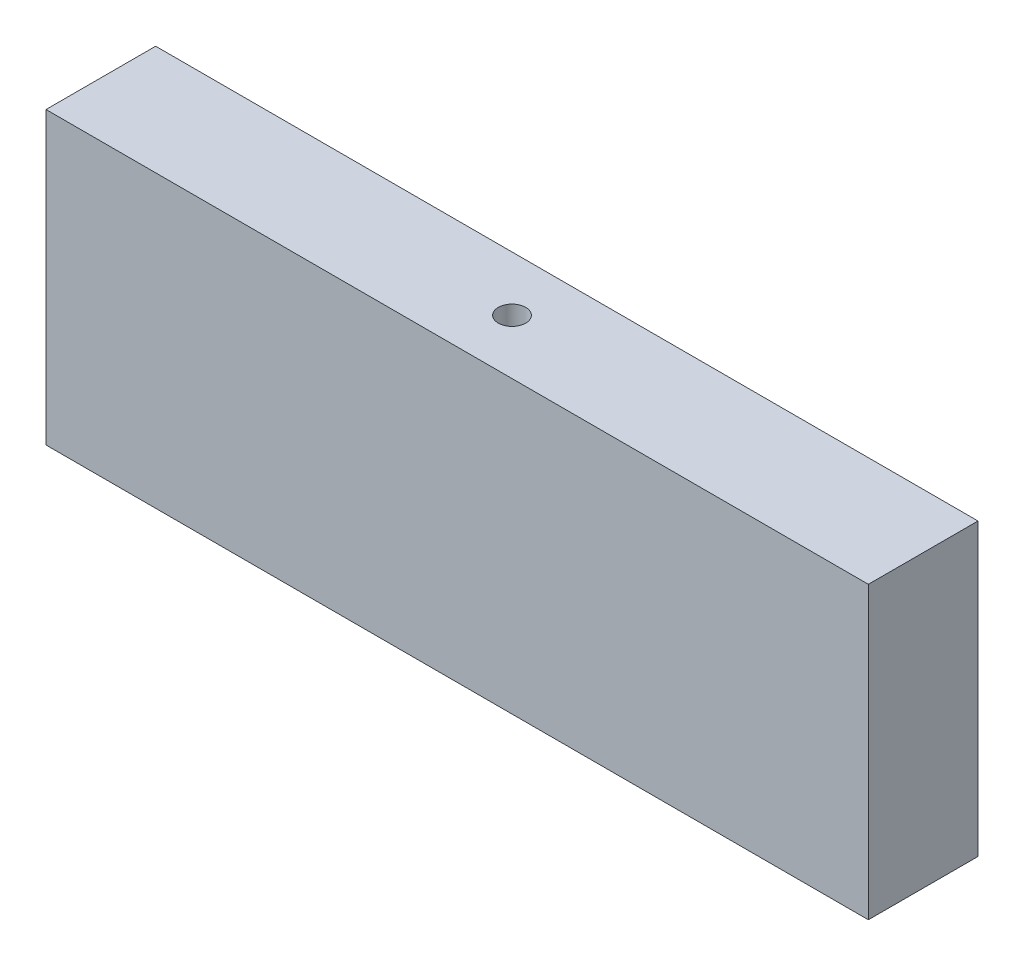
ISO-10303-21;
HEADER;
FILE_DESCRIPTION(('STEP AP214'),'2;1');
FILE_NAME('part.step','',(''),(''),'','','');
FILE_SCHEMA(('AUTOMOTIVE_DESIGN { 1 0 10303 214 1 1 1 1 }'));
ENDSEC;
DATA;
#1=APPLICATION_CONTEXT('core data for automotive mechanical design processes');
#2=APPLICATION_PROTOCOL_DEFINITION('international standard','automotive_design',2000,#1);
#3=PRODUCT_CONTEXT('',#1,'mechanical');
#4=PRODUCT('Part','Part','',(#3));
#5=PRODUCT_RELATED_PRODUCT_CATEGORY('part','',(#4));
#6=PRODUCT_DEFINITION_FORMATION('','',#4);
#7=PRODUCT_DEFINITION_CONTEXT('part definition',#1,'design');
#8=PRODUCT_DEFINITION('design','',#6,#7);
#9=PRODUCT_DEFINITION_SHAPE('','',#8);
#10=(LENGTH_UNIT() NAMED_UNIT(*) SI_UNIT(.MILLI.,.METRE.));
#11=(NAMED_UNIT(*) PLANE_ANGLE_UNIT() SI_UNIT($,.RADIAN.));
#12=(NAMED_UNIT(*) SI_UNIT($,.STERADIAN.) SOLID_ANGLE_UNIT());
#13=UNCERTAINTY_MEASURE_WITH_UNIT(LENGTH_MEASURE(1.E-05),#10,'distance_accuracy_value','');
#14=(GEOMETRIC_REPRESENTATION_CONTEXT(3) GLOBAL_UNCERTAINTY_ASSIGNED_CONTEXT((#13)) GLOBAL_UNIT_ASSIGNED_CONTEXT((#10,
#11,#12)) REPRESENTATION_CONTEXT('',''));
#15=CARTESIAN_POINT('',(0.,0.,0.));
#16=DIRECTION('',(0.,0.,1.));
#17=DIRECTION('',(1.,0.,0.));
#18=AXIS2_PLACEMENT_3D('',#15,#16,#17);
#19=CARTESIAN_POINT('',(75.,26.5,10.));
#20=DIRECTION('',(-1.,0.,0.));
#21=DIRECTION('',(0.,-1.,0.));
#22=AXIS2_PLACEMENT_3D('',#19,#20,#21);
#23=PLANE('',#22);
#24=DIRECTION('',(0.,1.,0.));
#25=VECTOR('',#24,1.);
#26=CARTESIAN_POINT('',(75.,26.5,-10.));
#27=LINE('',#26,#25);
#28=CARTESIAN_POINT('',(75.,-26.5,-10.));
#29=VERTEX_POINT('',#28);
#30=CARTESIAN_POINT('',(75.,26.5,-10.));
#31=VERTEX_POINT('',#30);
#32=EDGE_CURVE('E100',#29,#31,#27,.T.);
#33=ORIENTED_EDGE('',*,*,#32,.T.);
#34=DIRECTION('',(0.,0.,-1.));
#35=VECTOR('',#34,1.);
#36=CARTESIAN_POINT('',(75.,26.5,10.));
#37=LINE('',#36,#35);
#38=CARTESIAN_POINT('',(75.,26.5,10.));
#39=VERTEX_POINT('',#38);
#40=EDGE_CURVE('E11',#39,#31,#37,.T.);
#41=ORIENTED_EDGE('',*,*,#40,.F.);
#42=DIRECTION('',(0.,1.,0.));
#43=VECTOR('',#42,1.);
#44=CARTESIAN_POINT('',(75.,26.5,10.));
#45=LINE('',#44,#43);
#46=CARTESIAN_POINT('',(75.,-26.5,10.));
#47=VERTEX_POINT('',#46);
#48=EDGE_CURVE('E88',#47,#39,#45,.T.);
#49=ORIENTED_EDGE('',*,*,#48,.F.);
#50=DIRECTION('',(0.,0.,-1.));
#51=VECTOR('',#50,1.);
#52=CARTESIAN_POINT('',(75.,-26.5,10.));
#53=LINE('',#52,#51);
#54=EDGE_CURVE('E96',#47,#29,#53,.T.);
#55=ORIENTED_EDGE('',*,*,#54,.T.);
#56=EDGE_LOOP('',(#33,#41,#49,#55));
#57=FACE_BOUND('',#56,.T.);
#58=ADVANCED_FACE('F37',(#57),#23,.F.);
#59=CARTESIAN_POINT('',(-75.,26.5,10.));
#60=DIRECTION('',(0.,-1.,0.));
#61=DIRECTION('',(0.,0.,-1.));
#62=AXIS2_PLACEMENT_3D('',#59,#60,#61);
#63=PLANE('',#62);
#64=CARTESIAN_POINT('',(0.,26.5,0.));
#65=DIRECTION('',(0.,1.,0.));
#66=DIRECTION('',(0.,0.,1.));
#67=AXIS2_PLACEMENT_3D('',#64,#65,#66);
#68=CIRCLE('',#67,2.5);
#69=CARTESIAN_POINT('',(0.,26.5,2.5));
#70=VERTEX_POINT('',#69);
#71=EDGE_CURVE('E116',#70,#70,#68,.T.);
#72=ORIENTED_EDGE('',*,*,#71,.F.);
#73=EDGE_LOOP('',(#72));
#74=FACE_BOUND('',#73,.T.);
#75=DIRECTION('',(-1.,0.,0.));
#76=VECTOR('',#75,1.);
#77=CARTESIAN_POINT('',(-75.,26.5,-10.));
#78=LINE('',#77,#76);
#79=CARTESIAN_POINT('',(-75.,26.5,-10.));
#80=VERTEX_POINT('',#79);
#81=EDGE_CURVE('E92',#31,#80,#78,.T.);
#82=ORIENTED_EDGE('',*,*,#81,.T.);
#83=DIRECTION('',(0.,0.,-1.));
#84=VECTOR('',#83,1.);
#85=CARTESIAN_POINT('',(-75.,26.5,10.));
#86=LINE('',#85,#84);
#87=CARTESIAN_POINT('',(-75.,26.5,10.));
#88=VERTEX_POINT('',#87);
#89=EDGE_CURVE('E45',#88,#80,#86,.T.);
#90=ORIENTED_EDGE('',*,*,#89,.F.);
#91=DIRECTION('',(-1.,0.,0.));
#92=VECTOR('',#91,1.);
#93=CARTESIAN_POINT('',(-75.,26.5,10.));
#94=LINE('',#93,#92);
#95=EDGE_CURVE('E83',#39,#88,#94,.T.);
#96=ORIENTED_EDGE('',*,*,#95,.F.);
#97=ORIENTED_EDGE('',*,*,#40,.T.);
#98=EDGE_LOOP('',(#82,#90,#96,#97));
#99=FACE_BOUND('',#98,.T.);
#100=ADVANCED_FACE('F91',(#74,#99),#63,.F.);
#101=CARTESIAN_POINT('',(-75.,26.5,10.));
#102=DIRECTION('',(1.,0.,0.));
#103=DIRECTION('',(0.,0.,-1.));
#104=AXIS2_PLACEMENT_3D('',#101,#102,#103);
#105=PLANE('',#104);
#106=DIRECTION('',(0.,-1.,0.));
#107=VECTOR('',#106,1.);
#108=CARTESIAN_POINT('',(-75.,26.5,-10.));
#109=LINE('',#108,#107);
#110=CARTESIAN_POINT('',(-75.,-26.5,-10.));
#111=VERTEX_POINT('',#110);
#112=EDGE_CURVE('E70',#80,#111,#109,.T.);
#113=ORIENTED_EDGE('',*,*,#112,.T.);
#114=DIRECTION('',(0.,0.,-1.));
#115=VECTOR('',#114,1.);
#116=CARTESIAN_POINT('',(-75.,-26.5,10.));
#117=LINE('',#116,#115);
#118=CARTESIAN_POINT('',(-75.,-26.5,10.));
#119=VERTEX_POINT('',#118);
#120=EDGE_CURVE('E93',#119,#111,#117,.T.);
#121=ORIENTED_EDGE('',*,*,#120,.F.);
#122=DIRECTION('',(0.,-1.,0.));
#123=VECTOR('',#122,1.);
#124=CARTESIAN_POINT('',(-75.,26.5,10.));
#125=LINE('',#124,#123);
#126=EDGE_CURVE('E86',#88,#119,#125,.T.);
#127=ORIENTED_EDGE('',*,*,#126,.F.);
#128=ORIENTED_EDGE('',*,*,#89,.T.);
#129=EDGE_LOOP('',(#113,#121,#127,#128));
#130=FACE_BOUND('',#129,.T.);
#131=ADVANCED_FACE('F94',(#130),#105,.F.);
#132=CARTESIAN_POINT('',(-75.,-26.5,10.));
#133=DIRECTION('',(0.,1.,0.));
#134=DIRECTION('',(0.,0.,1.));
#135=AXIS2_PLACEMENT_3D('',#132,#133,#134);
#136=PLANE('',#135);
#137=CARTESIAN_POINT('',(0.,-26.5,0.));
#138=DIRECTION('',(0.,1.,0.));
#139=DIRECTION('',(0.,0.,1.));
#140=AXIS2_PLACEMENT_3D('',#137,#138,#139);
#141=CIRCLE('',#140,2.5);
#142=CARTESIAN_POINT('',(0.,-26.5,2.5));
#143=VERTEX_POINT('',#142);
#144=EDGE_CURVE('E103',#143,#143,#141,.T.);
#145=ORIENTED_EDGE('',*,*,#144,.T.);
#146=EDGE_LOOP('',(#145));
#147=FACE_BOUND('',#146,.T.);
#148=DIRECTION('',(1.,0.,0.));
#149=VECTOR('',#148,1.);
#150=CARTESIAN_POINT('',(-75.,-26.5,-10.));
#151=LINE('',#150,#149);
#152=EDGE_CURVE('E76',#111,#29,#151,.T.);
#153=ORIENTED_EDGE('',*,*,#152,.T.);
#154=ORIENTED_EDGE('',*,*,#54,.F.);
#155=DIRECTION('',(1.,0.,0.));
#156=VECTOR('',#155,1.);
#157=CARTESIAN_POINT('',(-75.,-26.5,10.));
#158=LINE('',#157,#156);
#159=EDGE_CURVE('E53',#119,#47,#158,.T.);
#160=ORIENTED_EDGE('',*,*,#159,.F.);
#161=ORIENTED_EDGE('',*,*,#120,.T.);
#162=EDGE_LOOP('',(#153,#154,#160,#161));
#163=FACE_BOUND('',#162,.T.);
#164=ADVANCED_FACE('F108',(#147,#163),#136,.F.);
#165=CARTESIAN_POINT('',(0.,0.,10.));
#166=DIRECTION('',(0.,0.,1.));
#167=DIRECTION('',(1.,0.,0.));
#168=AXIS2_PLACEMENT_3D('',#165,#166,#167);
#169=PLANE('',#168);
#170=ORIENTED_EDGE('',*,*,#48,.T.);
#171=ORIENTED_EDGE('',*,*,#95,.T.);
#172=ORIENTED_EDGE('',*,*,#126,.T.);
#173=ORIENTED_EDGE('',*,*,#159,.T.);
#174=EDGE_LOOP('',(#170,#171,#172,#173));
#175=FACE_BOUND('',#174,.T.);
#176=ADVANCED_FACE('F84',(#175),#169,.T.);
#177=CARTESIAN_POINT('',(0.,0.,-10.));
#178=DIRECTION('',(0.,0.,1.));
#179=DIRECTION('',(1.,0.,0.));
#180=AXIS2_PLACEMENT_3D('',#177,#178,#179);
#181=PLANE('',#180);
#182=ORIENTED_EDGE('',*,*,#32,.F.);
#183=ORIENTED_EDGE('',*,*,#152,.F.);
#184=ORIENTED_EDGE('',*,*,#112,.F.);
#185=ORIENTED_EDGE('',*,*,#81,.F.);
#186=EDGE_LOOP('',(#182,#183,#184,#185));
#187=FACE_BOUND('',#186,.T.);
#188=ADVANCED_FACE('F111',(#187),#181,.F.);
#189=CARTESIAN_POINT('',(0.,-26.5,0.));
#190=DIRECTION('',(0.,1.,0.));
#191=DIRECTION('',(0.,0.,1.));
#192=AXIS2_PLACEMENT_3D('',#189,#190,#191);
#193=CYLINDRICAL_SURFACE('',#192,2.5);
#194=CARTESIAN_POINT('',(0.,-26.5,2.5));
#195=CARTESIAN_POINT('',(0.,-25.9479166666667,2.5));
#196=CARTESIAN_POINT('',(0.,-25.3958333333333,2.5));
#197=CARTESIAN_POINT('',(0.,-24.2916666666667,2.5));
#198=CARTESIAN_POINT('',(0.,-23.7395833333333,2.5));
#199=CARTESIAN_POINT('',(0.,-22.6354166666667,2.5));
#200=CARTESIAN_POINT('',(0.,-22.0833333333333,2.5));
#201=CARTESIAN_POINT('',(0.,-20.9791666666667,2.5));
#202=CARTESIAN_POINT('',(0.,-20.4270833333333,2.5));
#203=CARTESIAN_POINT('',(0.,-19.3229166666667,2.5));
#204=CARTESIAN_POINT('',(0.,-18.7708333333333,2.5));
#205=CARTESIAN_POINT('',(0.,-17.6666666666667,2.5));
#206=CARTESIAN_POINT('',(0.,-17.1145833333333,2.5));
#207=CARTESIAN_POINT('',(0.,-16.0104166666667,2.5));
#208=CARTESIAN_POINT('',(0.,-15.4583333333333,2.5));
#209=CARTESIAN_POINT('',(0.,-14.3541666666667,2.5));
#210=CARTESIAN_POINT('',(0.,-13.8020833333333,2.5));
#211=CARTESIAN_POINT('',(0.,-12.6979166666667,2.5));
#212=CARTESIAN_POINT('',(0.,-12.1458333333333,2.5));
#213=CARTESIAN_POINT('',(0.,-11.0416666666667,2.5));
#214=CARTESIAN_POINT('',(0.,-10.4895833333333,2.5));
#215=CARTESIAN_POINT('',(0.,-9.38541666666668,2.5));
#216=CARTESIAN_POINT('',(0.,-8.83333333333334,2.5));
#217=CARTESIAN_POINT('',(0.,-7.72916666666668,2.5));
#218=CARTESIAN_POINT('',(0.,-7.17708333333334,2.5));
#219=CARTESIAN_POINT('',(0.,-6.07291666666668,2.5));
#220=CARTESIAN_POINT('',(0.,-5.52083333333334,2.5));
#221=CARTESIAN_POINT('',(0.,-4.41666666666668,2.5));
#222=CARTESIAN_POINT('',(0.,-3.86458333333334,2.5));
#223=CARTESIAN_POINT('',(0.,-2.76041666666668,2.5));
#224=CARTESIAN_POINT('',(0.,-2.20833333333334,2.5));
#225=CARTESIAN_POINT('',(0.,-1.10416666666668,2.5));
#226=CARTESIAN_POINT('',(0.,-0.552083333333344,2.5));
#227=CARTESIAN_POINT('',(0.,0.552083333333323,2.5));
#228=CARTESIAN_POINT('',(0.,1.10416666666666,2.5));
#229=CARTESIAN_POINT('',(0.,2.20833333333332,2.5));
#230=CARTESIAN_POINT('',(0.,2.76041666666666,2.5));
#231=CARTESIAN_POINT('',(0.,3.86458333333332,2.5));
#232=CARTESIAN_POINT('',(0.,4.41666666666666,2.5));
#233=CARTESIAN_POINT('',(0.,5.52083333333332,2.5));
#234=CARTESIAN_POINT('',(0.,6.07291666666666,2.5));
#235=CARTESIAN_POINT('',(0.,7.17708333333332,2.5));
#236=CARTESIAN_POINT('',(0.,7.72916666666666,2.5));
#237=CARTESIAN_POINT('',(0.,8.83333333333333,2.5));
#238=CARTESIAN_POINT('',(0.,9.38541666666666,2.5));
#239=CARTESIAN_POINT('',(0.,10.4895833333333,2.5));
#240=CARTESIAN_POINT('',(0.,11.0416666666667,2.5));
#241=CARTESIAN_POINT('',(0.,12.1458333333333,2.5));
#242=CARTESIAN_POINT('',(0.,12.6979166666667,2.5));
#243=CARTESIAN_POINT('',(0.,13.8020833333333,2.5));
#244=CARTESIAN_POINT('',(0.,14.3541666666667,2.5));
#245=CARTESIAN_POINT('',(0.,15.4583333333333,2.5));
#246=CARTESIAN_POINT('',(0.,16.0104166666667,2.5));
#247=CARTESIAN_POINT('',(0.,17.1145833333333,2.5));
#248=CARTESIAN_POINT('',(0.,17.6666666666667,2.5));
#249=CARTESIAN_POINT('',(0.,18.7708333333333,2.5));
#250=CARTESIAN_POINT('',(0.,19.3229166666667,2.5));
#251=CARTESIAN_POINT('',(0.,20.4270833333333,2.5));
#252=CARTESIAN_POINT('',(0.,20.9791666666667,2.5));
#253=CARTESIAN_POINT('',(0.,22.0833333333333,2.5));
#254=CARTESIAN_POINT('',(0.,22.6354166666667,2.5));
#255=CARTESIAN_POINT('',(0.,23.7395833333333,2.5));
#256=CARTESIAN_POINT('',(0.,24.2916666666667,2.5));
#257=CARTESIAN_POINT('',(0.,25.3958333333333,2.5));
#258=CARTESIAN_POINT('',(0.,25.9479166666667,2.5));
#259=CARTESIAN_POINT('',(0.,26.5,2.5));
#260=B_SPLINE_CURVE_WITH_KNOTS('',3,(#194,#195,#196,#197,#198,#199,#200,#201,#202,#203,#204,
#205,#206,#207,#208,#209,#210,#211,#212,#213,#214,#215,#216,#217,#218,#219,#220,#221,#222,#223,
#224,#225,#226,#227,#228,#229,#230,#231,#232,#233,#234,#235,#236,#237,#238,#239,#240,#241,#242,
#243,#244,#245,#246,#247,#248,#249,#250,#251,#252,#253,#254,#255,#256,#257,#258,#259),
.UNSPECIFIED.,.F.,.F.,(4,2,2,2,2,2,2,2,2,2,2,2,2,2,2,2,2,2,2,2,2,2,2,2,2,2,2,2,2,2,2,2,4),(0.,
1.65625,3.3125,4.96875,6.625,8.28125,9.9375,11.59375,13.25,14.90625,16.5625,18.21875,19.875,
21.53125,23.1875,24.84375,26.5,28.15625,29.8125,31.46875,33.125,34.78125,36.4375,38.09375,39.75,
41.40625,43.0625,44.71875,46.375,48.03125,49.6875,51.34375,53.),.UNSPECIFIED.);
#261=EDGE_CURVE('BSEAM120',#143,#70,#260,.T.);
#262=ORIENTED_EDGE('',*,*,#144,.F.);
#263=ORIENTED_EDGE('',*,*,#71,.T.);
#264=ORIENTED_EDGE('',*,*,#261,.T.);
#265=ORIENTED_EDGE('',*,*,#261,.F.);
#266=EDGE_LOOP('',(#262,#264,#263,#265));
#267=FACE_BOUND('',#266,.T.);
#268=ADVANCED_FACE('F120',(#267),#193,.F.);
#269=CLOSED_SHELL('',(#58,#100,#131,#164,#176,#188,#268));
#270=MANIFOLD_SOLID_BREP('B2',#269);
#271=ADVANCED_BREP_SHAPE_REPRESENTATION('',(#18,#270),#14);
#272=SHAPE_DEFINITION_REPRESENTATION(#9,#271);
ENDSEC;
END-ISO-10303-21;
